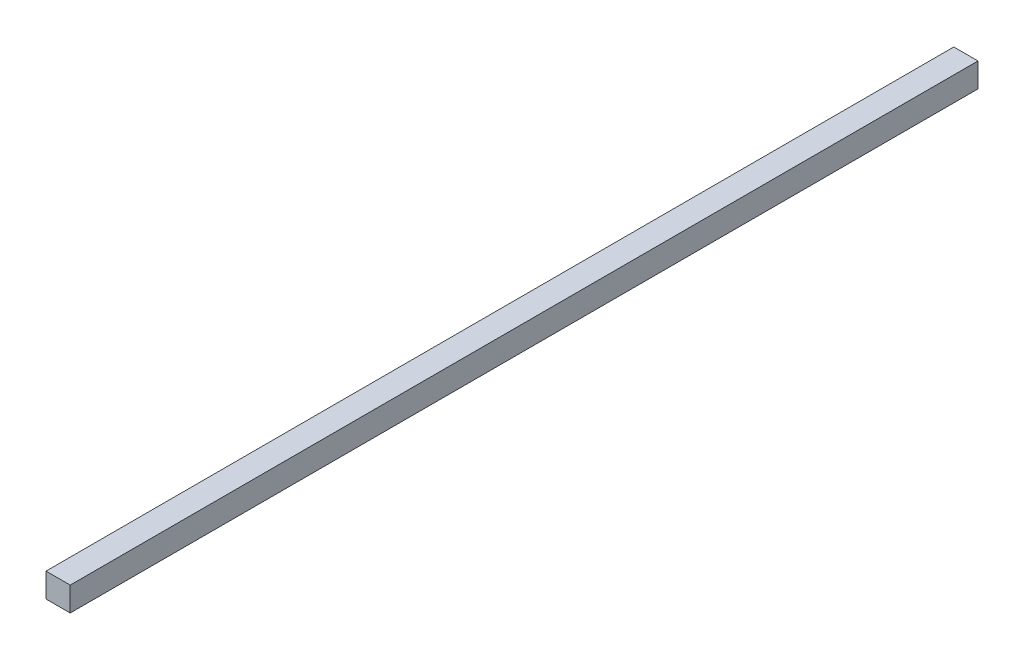
ISO-10303-21;
HEADER;
FILE_DESCRIPTION(('STEP AP214'),'2;1');
FILE_NAME('part.step','',(''),(''),'','','');
FILE_SCHEMA(('AUTOMOTIVE_DESIGN { 1 0 10303 214 1 1 1 1 }'));
ENDSEC;
DATA;
#1=APPLICATION_CONTEXT('core data for automotive mechanical design processes');
#2=APPLICATION_PROTOCOL_DEFINITION('international standard','automotive_design',2000,#1);
#3=PRODUCT_CONTEXT('',#1,'mechanical');
#4=PRODUCT('Part','Part','',(#3));
#5=PRODUCT_RELATED_PRODUCT_CATEGORY('part','',(#4));
#6=PRODUCT_DEFINITION_FORMATION('','',#4);
#7=PRODUCT_DEFINITION_CONTEXT('part definition',#1,'design');
#8=PRODUCT_DEFINITION('design','',#6,#7);
#9=PRODUCT_DEFINITION_SHAPE('','',#8);
#10=(LENGTH_UNIT() NAMED_UNIT(*) SI_UNIT(.MILLI.,.METRE.));
#11=(NAMED_UNIT(*) PLANE_ANGLE_UNIT() SI_UNIT($,.RADIAN.));
#12=(NAMED_UNIT(*) SI_UNIT($,.STERADIAN.) SOLID_ANGLE_UNIT());
#13=UNCERTAINTY_MEASURE_WITH_UNIT(LENGTH_MEASURE(1.E-05),#10,'distance_accuracy_value','');
#14=(GEOMETRIC_REPRESENTATION_CONTEXT(3) GLOBAL_UNCERTAINTY_ASSIGNED_CONTEXT((#13)) GLOBAL_UNIT_ASSIGNED_CONTEXT((#10,
#11,#12)) REPRESENTATION_CONTEXT('',''));
#15=CARTESIAN_POINT('',(0.,0.,0.));
#16=DIRECTION('',(0.,0.,1.));
#17=DIRECTION('',(1.,0.,0.));
#18=AXIS2_PLACEMENT_3D('',#15,#16,#17);
#19=CARTESIAN_POINT('',(10.,-10.,750.));
#20=DIRECTION('',(-1.,0.,0.));
#21=DIRECTION('',(0.,0.,1.));
#22=AXIS2_PLACEMENT_3D('',#19,#20,#21);
#23=PLANE('',#22);
#24=DIRECTION('',(0.,1.,0.));
#25=VECTOR('',#24,1.);
#26=CARTESIAN_POINT('',(10.,-10.,0.));
#27=LINE('',#26,#25);
#28=CARTESIAN_POINT('',(10.,-10.,0.));
#29=VERTEX_POINT('',#28);
#30=CARTESIAN_POINT('',(10.,10.,0.));
#31=VERTEX_POINT('',#30);
#32=EDGE_CURVE('E111',#29,#31,#27,.T.);
#33=ORIENTED_EDGE('',*,*,#32,.T.);
#34=DIRECTION('',(0.,0.,-1.));
#35=VECTOR('',#34,1.);
#36=CARTESIAN_POINT('',(10.,10.,750.));
#37=LINE('',#36,#35);
#38=CARTESIAN_POINT('',(10.,10.,750.));
#39=VERTEX_POINT('',#38);
#40=EDGE_CURVE('E11',#39,#31,#37,.T.);
#41=ORIENTED_EDGE('',*,*,#40,.F.);
#42=DIRECTION('',(0.,1.,0.));
#43=VECTOR('',#42,1.);
#44=CARTESIAN_POINT('',(10.,-10.,750.));
#45=LINE('',#44,#43);
#46=CARTESIAN_POINT('',(10.,-10.,750.));
#47=VERTEX_POINT('',#46);
#48=EDGE_CURVE('E100',#47,#39,#45,.T.);
#49=ORIENTED_EDGE('',*,*,#48,.F.);
#50=DIRECTION('',(0.,0.,-1.));
#51=VECTOR('',#50,1.);
#52=CARTESIAN_POINT('',(10.,-10.,750.));
#53=LINE('',#52,#51);
#54=EDGE_CURVE('E106',#47,#29,#53,.T.);
#55=ORIENTED_EDGE('',*,*,#54,.T.);
#56=EDGE_LOOP('',(#33,#41,#49,#55));
#57=FACE_BOUND('',#56,.T.);
#58=ADVANCED_FACE('F44',(#57),#23,.F.);
#59=CARTESIAN_POINT('',(-10.,10.,750.));
#60=DIRECTION('',(0.,-1.,0.));
#61=DIRECTION('',(0.,0.,-1.));
#62=AXIS2_PLACEMENT_3D('',#59,#60,#61);
#63=PLANE('',#62);
#64=DIRECTION('',(-1.,0.,0.));
#65=VECTOR('',#64,1.);
#66=CARTESIAN_POINT('',(-10.,10.,0.));
#67=LINE('',#66,#65);
#68=CARTESIAN_POINT('',(-10.,10.,0.));
#69=VERTEX_POINT('',#68);
#70=EDGE_CURVE('E105',#31,#69,#67,.T.);
#71=ORIENTED_EDGE('',*,*,#70,.T.);
#72=DIRECTION('',(0.,0.,-1.));
#73=VECTOR('',#72,1.);
#74=CARTESIAN_POINT('',(-10.,10.,750.));
#75=LINE('',#74,#73);
#76=CARTESIAN_POINT('',(-10.,10.,750.));
#77=VERTEX_POINT('',#76);
#78=EDGE_CURVE('E53',#77,#69,#75,.T.);
#79=ORIENTED_EDGE('',*,*,#78,.F.);
#80=DIRECTION('',(-1.,0.,0.));
#81=VECTOR('',#80,1.);
#82=CARTESIAN_POINT('',(-10.,10.,750.));
#83=LINE('',#82,#81);
#84=EDGE_CURVE('E95',#39,#77,#83,.T.);
#85=ORIENTED_EDGE('',*,*,#84,.F.);
#86=ORIENTED_EDGE('',*,*,#40,.T.);
#87=EDGE_LOOP('',(#71,#79,#85,#86));
#88=FACE_BOUND('',#87,.T.);
#89=ADVANCED_FACE('F102',(#88),#63,.F.);
#90=CARTESIAN_POINT('',(-10.,-10.,750.));
#91=DIRECTION('',(1.,0.,0.));
#92=DIRECTION('',(0.,0.,-1.));
#93=AXIS2_PLACEMENT_3D('',#90,#91,#92);
#94=PLANE('',#93);
#95=DIRECTION('',(0.,-1.,0.));
#96=VECTOR('',#95,1.);
#97=CARTESIAN_POINT('',(-10.,-10.,0.));
#98=LINE('',#97,#96);
#99=CARTESIAN_POINT('',(-10.,-10.,0.));
#100=VERTEX_POINT('',#99);
#101=EDGE_CURVE('E80',#69,#100,#98,.T.);
#102=ORIENTED_EDGE('',*,*,#101,.T.);
#103=DIRECTION('',(0.,0.,-1.));
#104=VECTOR('',#103,1.);
#105=CARTESIAN_POINT('',(-10.,-10.,750.));
#106=LINE('',#105,#104);
#107=CARTESIAN_POINT('',(-10.,-10.,750.));
#108=VERTEX_POINT('',#107);
#109=EDGE_CURVE('E101',#108,#100,#106,.T.);
#110=ORIENTED_EDGE('',*,*,#109,.F.);
#111=DIRECTION('',(0.,-1.,0.));
#112=VECTOR('',#111,1.);
#113=CARTESIAN_POINT('',(-10.,-10.,750.));
#114=LINE('',#113,#112);
#115=EDGE_CURVE('E94',#77,#108,#114,.T.);
#116=ORIENTED_EDGE('',*,*,#115,.F.);
#117=ORIENTED_EDGE('',*,*,#78,.T.);
#118=EDGE_LOOP('',(#102,#110,#116,#117));
#119=FACE_BOUND('',#118,.T.);
#120=ADVANCED_FACE('F103',(#119),#94,.F.);
#121=CARTESIAN_POINT('',(-10.,-10.,750.));
#122=DIRECTION('',(0.,1.,0.));
#123=DIRECTION('',(0.,0.,1.));
#124=AXIS2_PLACEMENT_3D('',#121,#122,#123);
#125=PLANE('',#124);
#126=DIRECTION('',(1.,0.,0.));
#127=VECTOR('',#126,1.);
#128=CARTESIAN_POINT('',(-10.,-10.,0.));
#129=LINE('',#128,#127);
#130=EDGE_CURVE('E82',#100,#29,#129,.T.);
#131=ORIENTED_EDGE('',*,*,#130,.T.);
#132=ORIENTED_EDGE('',*,*,#54,.F.);
#133=DIRECTION('',(1.,0.,0.));
#134=VECTOR('',#133,1.);
#135=CARTESIAN_POINT('',(-10.,-10.,750.));
#136=LINE('',#135,#134);
#137=EDGE_CURVE('E64',#108,#47,#136,.T.);
#138=ORIENTED_EDGE('',*,*,#137,.F.);
#139=ORIENTED_EDGE('',*,*,#109,.T.);
#140=EDGE_LOOP('',(#131,#132,#138,#139));
#141=FACE_BOUND('',#140,.T.);
#142=ADVANCED_FACE('F128',(#141),#125,.F.);
#143=CARTESIAN_POINT('',(0.,0.,750.));
#144=DIRECTION('',(0.,0.,-1.));
#145=DIRECTION('',(-1.,0.,0.));
#146=AXIS2_PLACEMENT_3D('',#143,#144,#145);
#147=PLANE('',#146);
#148=ORIENTED_EDGE('',*,*,#48,.T.);
#149=ORIENTED_EDGE('',*,*,#84,.T.);
#150=ORIENTED_EDGE('',*,*,#115,.T.);
#151=ORIENTED_EDGE('',*,*,#137,.T.);
#152=EDGE_LOOP('',(#148,#149,#150,#151));
#153=FACE_BOUND('',#152,.T.);
#154=ADVANCED_FACE('F93',(#153),#147,.F.);
#155=CARTESIAN_POINT('',(0.,0.,0.));
#156=DIRECTION('',(0.,0.,-1.));
#157=DIRECTION('',(-1.,0.,0.));
#158=AXIS2_PLACEMENT_3D('',#155,#156,#157);
#159=PLANE('',#158);
#160=ORIENTED_EDGE('',*,*,#32,.F.);
#161=ORIENTED_EDGE('',*,*,#130,.F.);
#162=ORIENTED_EDGE('',*,*,#101,.F.);
#163=ORIENTED_EDGE('',*,*,#70,.F.);
#164=EDGE_LOOP('',(#160,#161,#162,#163));
#165=FACE_BOUND('',#164,.T.);
#166=ADVANCED_FACE('F129',(#165),#159,.T.);
#167=CLOSED_SHELL('',(#58,#89,#120,#142,#154,#166));
#168=MANIFOLD_SOLID_BREP('B2',#167);
#169=ADVANCED_BREP_SHAPE_REPRESENTATION('',(#18,#168),#14);
#170=SHAPE_DEFINITION_REPRESENTATION(#9,#169);
ENDSEC;
END-ISO-10303-21;
